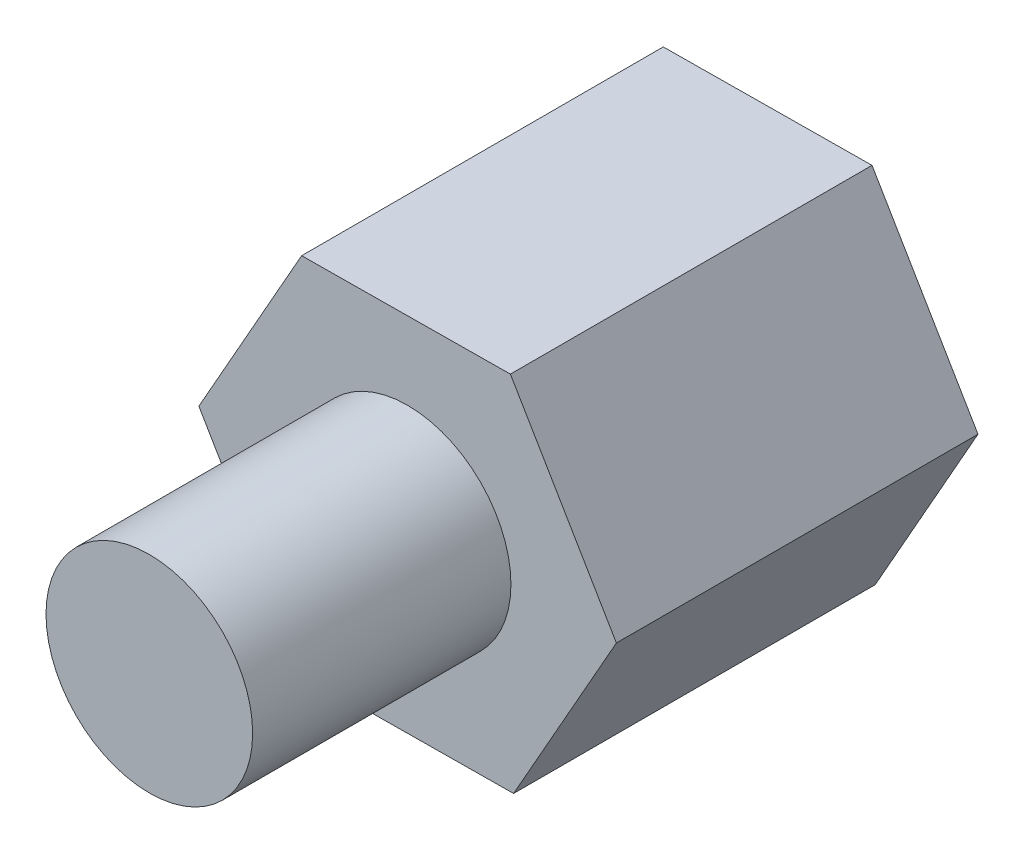
ISO-10303-21;
HEADER;
FILE_DESCRIPTION(('STEP AP214'),'2;1');
FILE_NAME('part.step','',(''),(''),'','','');
FILE_SCHEMA(('AUTOMOTIVE_DESIGN { 1 0 10303 214 1 1 1 1 }'));
ENDSEC;
DATA;
#1=APPLICATION_CONTEXT('core data for automotive mechanical design processes');
#2=APPLICATION_PROTOCOL_DEFINITION('international standard','automotive_design',2000,#1);
#3=PRODUCT_CONTEXT('',#1,'mechanical');
#4=PRODUCT('Part','Part','',(#3));
#5=PRODUCT_RELATED_PRODUCT_CATEGORY('part','',(#4));
#6=PRODUCT_DEFINITION_FORMATION('','',#4);
#7=PRODUCT_DEFINITION_CONTEXT('part definition',#1,'design');
#8=PRODUCT_DEFINITION('design','',#6,#7);
#9=PRODUCT_DEFINITION_SHAPE('','',#8);
#10=(LENGTH_UNIT() NAMED_UNIT(*) SI_UNIT(.MILLI.,.METRE.));
#11=(NAMED_UNIT(*) PLANE_ANGLE_UNIT() SI_UNIT($,.RADIAN.));
#12=(NAMED_UNIT(*) SI_UNIT($,.STERADIAN.) SOLID_ANGLE_UNIT());
#13=UNCERTAINTY_MEASURE_WITH_UNIT(LENGTH_MEASURE(1.E-05),#10,'distance_accuracy_value','');
#14=(GEOMETRIC_REPRESENTATION_CONTEXT(3) GLOBAL_UNCERTAINTY_ASSIGNED_CONTEXT((#13)) GLOBAL_UNIT_ASSIGNED_CONTEXT((#10,
#11,#12)) REPRESENTATION_CONTEXT('',''));
#15=CARTESIAN_POINT('',(0.,0.,0.));
#16=DIRECTION('',(0.,0.,1.));
#17=DIRECTION('',(1.,0.,0.));
#18=AXIS2_PLACEMENT_3D('',#15,#16,#17);
#19=CARTESIAN_POINT('',(0.,0.,12.));
#20=DIRECTION('',(0.,0.,-1.));
#21=DIRECTION('',(-1.,0.,0.));
#22=AXIS2_PLACEMENT_3D('',#19,#20,#21);
#23=CYLINDRICAL_SURFACE('',#22,2.);
#24=CARTESIAN_POINT('',(0.,0.,12.));
#25=DIRECTION('',(0.,0.,1.));
#26=DIRECTION('',(1.,0.,0.));
#27=AXIS2_PLACEMENT_3D('',#24,#25,#26);
#28=CIRCLE('',#27,2.);
#29=CARTESIAN_POINT('',(2.,0.,12.));
#30=VERTEX_POINT('',#29);
#31=EDGE_CURVE('E11',#30,#30,#28,.T.);
#32=ORIENTED_EDGE('',*,*,#31,.F.);
#33=EDGE_LOOP('',(#32));
#34=FACE_BOUND('',#33,.T.);
#35=CARTESIAN_POINT('',(0.,0.,7.));
#36=DIRECTION('',(0.,0.,1.));
#37=DIRECTION('',(1.,0.,0.));
#38=AXIS2_PLACEMENT_3D('',#35,#36,#37);
#39=CIRCLE('',#38,2.);
#40=CARTESIAN_POINT('',(2.,0.,7.));
#41=VERTEX_POINT('',#40);
#42=EDGE_CURVE('E50',#41,#41,#39,.T.);
#43=ORIENTED_EDGE('',*,*,#42,.T.);
#44=EDGE_LOOP('',(#43));
#45=FACE_BOUND('',#44,.T.);
#46=ADVANCED_FACE('F47',(#34,#45),#23,.T.);
#47=CARTESIAN_POINT('',(0.,0.,12.));
#48=DIRECTION('',(0.,0.,1.));
#49=DIRECTION('',(1.,0.,0.));
#50=AXIS2_PLACEMENT_3D('',#47,#48,#49);
#51=PLANE('',#50);
#52=ORIENTED_EDGE('',*,*,#31,.T.);
#53=EDGE_LOOP('',(#52));
#54=FACE_BOUND('',#53,.T.);
#55=ADVANCED_FACE('F62',(#54),#51,.T.);
#56=CARTESIAN_POINT('',(0.,0.,7.));
#57=DIRECTION('',(0.,0.,1.));
#58=DIRECTION('',(1.,0.,0.));
#59=AXIS2_PLACEMENT_3D('',#56,#57,#58);
#60=PLANE('',#59);
#61=ORIENTED_EDGE('',*,*,#42,.F.);
#62=EDGE_LOOP('',(#61));
#63=FACE_BOUND('',#62,.T.);
#64=ADVANCED_FACE('F60',(#63),#60,.F.);
#65=CLOSED_SHELL('',(#46,#55,#64));
#66=MANIFOLD_SOLID_BREP('B2',#65);
#67=CARTESIAN_POINT('',(0.,0.,7.));
#68=DIRECTION('',(0.,0.,1.));
#69=DIRECTION('',(1.,0.,0.));
#70=AXIS2_PLACEMENT_3D('',#67,#68,#69);
#71=PLANE('',#70);
#72=DIRECTION('',(0.999961257640527,0.00880245522430722,0.));
#73=VECTOR('',#72,1.);
#74=CARTESIAN_POINT('',(-1.98983906118775,-3.51765175136834,7.));
#75=LINE('',#74,#73);
#76=CARTESIAN_POINT('',(-1.98983906118775,-3.51765175136834,7.));
#77=VERTEX_POINT('',#76);
#78=CARTESIAN_POINT('',(2.05145624775792,-3.48207705211536,7.));
#79=VERTEX_POINT('',#78);
#80=EDGE_CURVE('E195',#77,#79,#75,.T.);
#81=ORIENTED_EDGE('',*,*,#80,.T.);
#82=DIRECTION('',(0.492357478980338,0.870393079529086,0.));
#83=VECTOR('',#82,1.);
#84=CARTESIAN_POINT('',(2.05145624775792,-3.48207705211536,7.));
#85=LINE('',#84,#83);
#86=CARTESIAN_POINT('',(4.04129530894568,0.0355746992529791,7.));
#87=VERTEX_POINT('',#86);
#88=EDGE_CURVE('E143',#79,#87,#85,.T.);
#89=ORIENTED_EDGE('',*,*,#88,.T.);
#90=DIRECTION('',(-0.507603778660189,0.861590624304779,0.));
#91=VECTOR('',#90,1.);
#92=CARTESIAN_POINT('',(4.04129530894568,0.0355746992529791,7.));
#93=LINE('',#92,#91);
#94=CARTESIAN_POINT('',(1.98983906118776,3.51765175136834,7.));
#95=VERTEX_POINT('',#94);
#96=EDGE_CURVE('E156',#87,#95,#93,.T.);
#97=ORIENTED_EDGE('',*,*,#96,.T.);
#98=DIRECTION('',(-0.999961257640527,-0.00880245522430723,0.));
#99=VECTOR('',#98,1.);
#100=CARTESIAN_POINT('',(1.98983906118776,3.51765175136834,7.));
#101=LINE('',#100,#99);
#102=CARTESIAN_POINT('',(-2.05145624775791,3.48207705211536,7.));
#103=VERTEX_POINT('',#102);
#104=EDGE_CURVE('E150',#95,#103,#101,.T.);
#105=ORIENTED_EDGE('',*,*,#104,.T.);
#106=DIRECTION('',(-0.492357478980338,-0.870393079529086,0.));
#107=VECTOR('',#106,1.);
#108=CARTESIAN_POINT('',(-2.05145624775791,3.48207705211536,7.));
#109=LINE('',#108,#107);
#110=CARTESIAN_POINT('',(-4.04129530894568,-0.0355746992529825,7.));
#111=VERTEX_POINT('',#110);
#112=EDGE_CURVE('E154',#103,#111,#109,.T.);
#113=ORIENTED_EDGE('',*,*,#112,.T.);
#114=DIRECTION('',(0.507603778660189,-0.861590624304779,0.));
#115=VECTOR('',#114,1.);
#116=CARTESIAN_POINT('',(-4.04129530894568,-0.0355746992529825,7.));
#117=LINE('',#116,#115);
#118=EDGE_CURVE('E106',#111,#77,#117,.T.);
#119=ORIENTED_EDGE('',*,*,#118,.T.);
#120=EDGE_LOOP('',(#81,#89,#97,#105,#113,#119));
#121=FACE_BOUND('',#120,.T.);
#122=CARTESIAN_POINT('',(0.,0.,7.));
#123=DIRECTION('',(0.,0.,1.));
#124=DIRECTION('',(1.,0.,0.));
#125=AXIS2_PLACEMENT_3D('',#122,#123,#124);
#126=CIRCLE('',#125,2.);
#127=CARTESIAN_POINT('',(2.,0.,7.));
#128=VERTEX_POINT('',#127);
#129=EDGE_CURVE('E183',#128,#128,#126,.T.);
#130=ORIENTED_EDGE('',*,*,#129,.F.);
#131=EDGE_LOOP('',(#130));
#132=FACE_BOUND('',#131,.T.);
#133=ADVANCED_FACE('F88',(#121,#132),#71,.T.);
#134=CARTESIAN_POINT('',(0.,0.,0.));
#135=DIRECTION('',(0.,0.,1.));
#136=DIRECTION('',(1.,0.,0.));
#137=AXIS2_PLACEMENT_3D('',#134,#135,#136);
#138=PLANE('',#137);
#139=DIRECTION('',(0.999961257640527,0.00880245522430722,0.));
#140=VECTOR('',#139,1.);
#141=CARTESIAN_POINT('',(-1.98983906118775,-3.51765175136834,0.));
#142=LINE('',#141,#140);
#143=CARTESIAN_POINT('',(-1.98983906118775,-3.51765175136834,0.));
#144=VERTEX_POINT('',#143);
#145=CARTESIAN_POINT('',(2.05145624775792,-3.48207705211536,0.));
#146=VERTEX_POINT('',#145);
#147=EDGE_CURVE('E178',#144,#146,#142,.T.);
#148=ORIENTED_EDGE('',*,*,#147,.F.);
#149=DIRECTION('',(0.507603778660189,-0.861590624304779,0.));
#150=VECTOR('',#149,1.);
#151=CARTESIAN_POINT('',(-4.04129530894568,-0.0355746992529825,0.));
#152=LINE('',#151,#150);
#153=CARTESIAN_POINT('',(-4.04129530894568,-0.0355746992529825,0.));
#154=VERTEX_POINT('',#153);
#155=EDGE_CURVE('E135',#154,#144,#152,.T.);
#156=ORIENTED_EDGE('',*,*,#155,.F.);
#157=DIRECTION('',(-0.492357478980338,-0.870393079529086,0.));
#158=VECTOR('',#157,1.);
#159=CARTESIAN_POINT('',(-2.05145624775791,3.48207705211536,0.));
#160=LINE('',#159,#158);
#161=CARTESIAN_POINT('',(-2.05145624775791,3.48207705211536,0.));
#162=VERTEX_POINT('',#161);
#163=EDGE_CURVE('E129',#162,#154,#160,.T.);
#164=ORIENTED_EDGE('',*,*,#163,.F.);
#165=DIRECTION('',(-0.999961257640527,-0.00880245522430723,0.));
#166=VECTOR('',#165,1.);
#167=CARTESIAN_POINT('',(1.98983906118776,3.51765175136834,0.));
#168=LINE('',#167,#166);
#169=CARTESIAN_POINT('',(1.98983906118776,3.51765175136834,0.));
#170=VERTEX_POINT('',#169);
#171=EDGE_CURVE('E165',#170,#162,#168,.T.);
#172=ORIENTED_EDGE('',*,*,#171,.F.);
#173=DIRECTION('',(-0.507603778660189,0.861590624304779,0.));
#174=VECTOR('',#173,1.);
#175=CARTESIAN_POINT('',(4.04129530894568,0.0355746992529791,0.));
#176=LINE('',#175,#174);
#177=CARTESIAN_POINT('',(4.04129530894568,0.0355746992529791,0.));
#178=VERTEX_POINT('',#177);
#179=EDGE_CURVE('E186',#178,#170,#176,.T.);
#180=ORIENTED_EDGE('',*,*,#179,.F.);
#181=DIRECTION('',(0.492357478980338,0.870393079529086,0.));
#182=VECTOR('',#181,1.);
#183=CARTESIAN_POINT('',(2.05145624775792,-3.48207705211536,0.));
#184=LINE('',#183,#182);
#185=EDGE_CURVE('E182',#146,#178,#184,.T.);
#186=ORIENTED_EDGE('',*,*,#185,.F.);
#187=EDGE_LOOP('',(#148,#156,#164,#172,#180,#186));
#188=FACE_BOUND('',#187,.T.);
#189=CARTESIAN_POINT('',(0.,0.,0.));
#190=DIRECTION('',(0.,0.,1.));
#191=DIRECTION('',(1.,0.,0.));
#192=AXIS2_PLACEMENT_3D('',#189,#190,#191);
#193=CIRCLE('',#192,2.);
#194=CARTESIAN_POINT('',(2.,0.,0.));
#195=VERTEX_POINT('',#194);
#196=EDGE_CURVE('E292',#195,#195,#193,.T.);
#197=ORIENTED_EDGE('',*,*,#196,.T.);
#198=EDGE_LOOP('',(#197));
#199=FACE_BOUND('',#198,.T.);
#200=ADVANCED_FACE('F208',(#188,#199),#138,.F.);
#201=CARTESIAN_POINT('',(-1.98983906118775,-3.51765175136834,7.));
#202=DIRECTION('',(-0.00880245522430722,0.999961257640527,0.));
#203=DIRECTION('',(-0.999961257640527,-0.00880245522430722,0.));
#204=AXIS2_PLACEMENT_3D('',#201,#202,#203);
#205=PLANE('',#204);
#206=ORIENTED_EDGE('',*,*,#147,.T.);
#207=DIRECTION('',(0.,0.,-1.));
#208=VECTOR('',#207,1.);
#209=CARTESIAN_POINT('',(2.05145624775792,-3.48207705211536,7.));
#210=LINE('',#209,#208);
#211=EDGE_CURVE('E45',#79,#146,#210,.T.);
#212=ORIENTED_EDGE('',*,*,#211,.F.);
#213=ORIENTED_EDGE('',*,*,#80,.F.);
#214=DIRECTION('',(0.,0.,-1.));
#215=VECTOR('',#214,1.);
#216=CARTESIAN_POINT('',(-1.98983906118775,-3.51765175136834,7.));
#217=LINE('',#216,#215);
#218=EDGE_CURVE('E174',#77,#144,#217,.T.);
#219=ORIENTED_EDGE('',*,*,#218,.T.);
#220=EDGE_LOOP('',(#206,#212,#213,#219));
#221=FACE_BOUND('',#220,.T.);
#222=ADVANCED_FACE('F90',(#221),#205,.F.);
#223=CARTESIAN_POINT('',(2.05145624775792,-3.48207705211536,7.));
#224=DIRECTION('',(-0.870393079529086,0.492357478980338,0.));
#225=DIRECTION('',(-0.492357478980338,-0.870393079529086,0.));
#226=AXIS2_PLACEMENT_3D('',#223,#224,#225);
#227=PLANE('',#226);
#228=ORIENTED_EDGE('',*,*,#185,.T.);
#229=DIRECTION('',(0.,0.,-1.));
#230=VECTOR('',#229,1.);
#231=CARTESIAN_POINT('',(4.04129530894568,0.0355746992529791,7.));
#232=LINE('',#231,#230);
#233=EDGE_CURVE('E98',#87,#178,#232,.T.);
#234=ORIENTED_EDGE('',*,*,#233,.F.);
#235=ORIENTED_EDGE('',*,*,#88,.F.);
#236=ORIENTED_EDGE('',*,*,#211,.T.);
#237=EDGE_LOOP('',(#228,#234,#235,#236));
#238=FACE_BOUND('',#237,.T.);
#239=ADVANCED_FACE('F233',(#238),#227,.F.);
#240=CARTESIAN_POINT('',(4.04129530894568,0.0355746992529791,7.));
#241=DIRECTION('',(-0.861590624304779,-0.507603778660189,0.));
#242=DIRECTION('',(0.507603778660189,-0.861590624304779,0.));
#243=AXIS2_PLACEMENT_3D('',#240,#241,#242);
#244=PLANE('',#243);
#245=ORIENTED_EDGE('',*,*,#179,.T.);
#246=DIRECTION('',(0.,0.,-1.));
#247=VECTOR('',#246,1.);
#248=CARTESIAN_POINT('',(1.98983906118776,3.51765175136834,7.));
#249=LINE('',#248,#247);
#250=EDGE_CURVE('E167',#95,#170,#249,.T.);
#251=ORIENTED_EDGE('',*,*,#250,.F.);
#252=ORIENTED_EDGE('',*,*,#96,.F.);
#253=ORIENTED_EDGE('',*,*,#233,.T.);
#254=EDGE_LOOP('',(#245,#251,#252,#253));
#255=FACE_BOUND('',#254,.T.);
#256=ADVANCED_FACE('F205',(#255),#244,.F.);
#257=CARTESIAN_POINT('',(1.98983906118776,3.51765175136834,7.));
#258=DIRECTION('',(0.00880245522430723,-0.999961257640527,0.));
#259=DIRECTION('',(0.999961257640527,0.00880245522430723,0.));
#260=AXIS2_PLACEMENT_3D('',#257,#258,#259);
#261=PLANE('',#260);
#262=ORIENTED_EDGE('',*,*,#171,.T.);
#263=DIRECTION('',(0.,0.,-1.));
#264=VECTOR('',#263,1.);
#265=CARTESIAN_POINT('',(-2.05145624775791,3.48207705211536,7.));
#266=LINE('',#265,#264);
#267=EDGE_CURVE('E162',#103,#162,#266,.T.);
#268=ORIENTED_EDGE('',*,*,#267,.F.);
#269=ORIENTED_EDGE('',*,*,#104,.F.);
#270=ORIENTED_EDGE('',*,*,#250,.T.);
#271=EDGE_LOOP('',(#262,#268,#269,#270));
#272=FACE_BOUND('',#271,.T.);
#273=ADVANCED_FACE('F163',(#272),#261,.F.);
#274=CARTESIAN_POINT('',(-2.05145624775791,3.48207705211536,7.));
#275=DIRECTION('',(0.870393079529086,-0.492357478980338,0.));
#276=DIRECTION('',(0.492357478980338,0.870393079529086,0.));
#277=AXIS2_PLACEMENT_3D('',#274,#275,#276);
#278=PLANE('',#277);
#279=ORIENTED_EDGE('',*,*,#163,.T.);
#280=DIRECTION('',(0.,0.,-1.));
#281=VECTOR('',#280,1.);
#282=CARTESIAN_POINT('',(-4.04129530894568,-0.0355746992529825,7.));
#283=LINE('',#282,#281);
#284=EDGE_CURVE('E168',#111,#154,#283,.T.);
#285=ORIENTED_EDGE('',*,*,#284,.F.);
#286=ORIENTED_EDGE('',*,*,#112,.F.);
#287=ORIENTED_EDGE('',*,*,#267,.T.);
#288=EDGE_LOOP('',(#279,#285,#286,#287));
#289=FACE_BOUND('',#288,.T.);
#290=ADVANCED_FACE('F170',(#289),#278,.F.);
#291=CARTESIAN_POINT('',(-4.04129530894568,-0.0355746992529825,7.));
#292=DIRECTION('',(0.861590624304779,0.507603778660189,0.));
#293=DIRECTION('',(-0.507603778660189,0.861590624304779,0.));
#294=AXIS2_PLACEMENT_3D('',#291,#292,#293);
#295=PLANE('',#294);
#296=ORIENTED_EDGE('',*,*,#155,.T.);
#297=ORIENTED_EDGE('',*,*,#218,.F.);
#298=ORIENTED_EDGE('',*,*,#118,.F.);
#299=ORIENTED_EDGE('',*,*,#284,.T.);
#300=EDGE_LOOP('',(#296,#297,#298,#299));
#301=FACE_BOUND('',#300,.T.);
#302=ADVANCED_FACE('F213',(#301),#295,.F.);
#303=CARTESIAN_POINT('',(0.,0.,7.));
#304=DIRECTION('',(0.,0.,-1.));
#305=DIRECTION('',(-1.,0.,0.));
#306=AXIS2_PLACEMENT_3D('',#303,#304,#305);
#307=CYLINDRICAL_SURFACE('',#306,2.);
#308=ORIENTED_EDGE('',*,*,#129,.T.);
#309=EDGE_LOOP('',(#308));
#310=FACE_BOUND('',#309,.T.);
#311=ORIENTED_EDGE('',*,*,#196,.F.);
#312=EDGE_LOOP('',(#311));
#313=FACE_BOUND('',#312,.T.);
#314=ADVANCED_FACE('F215',(#310,#313),#307,.F.);
#315=CLOSED_SHELL('',(#133,#200,#222,#239,#256,#273,#290,#302,#314));
#316=MANIFOLD_SOLID_BREP('B6',#315);
#317=ADVANCED_BREP_SHAPE_REPRESENTATION('',(#18,#66,#316),#14);
#318=SHAPE_DEFINITION_REPRESENTATION(#9,#317);
ENDSEC;
END-ISO-10303-21;
